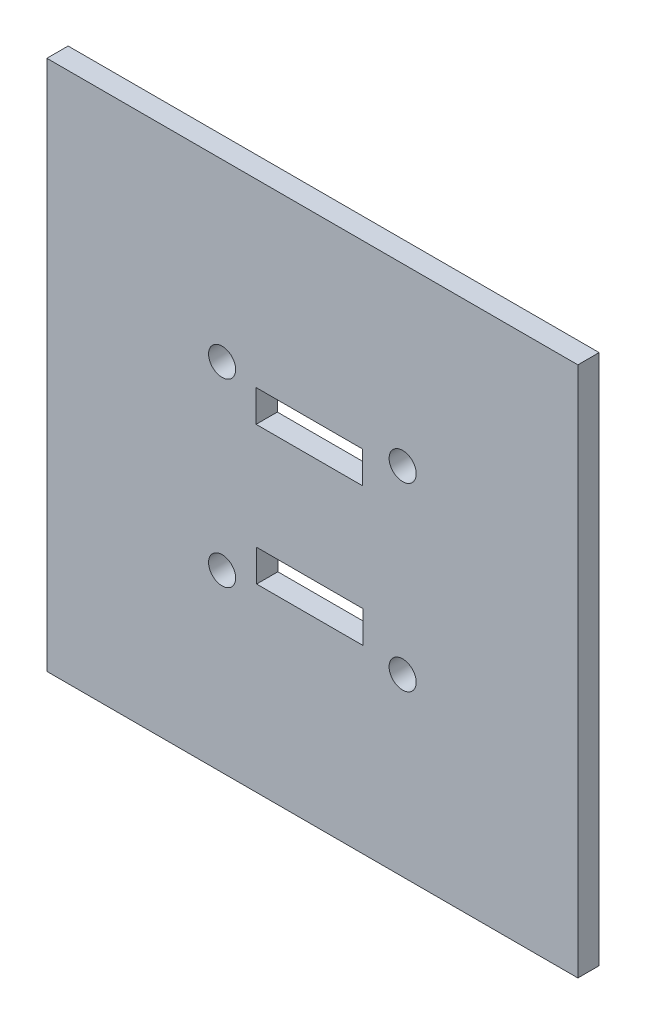
ISO-10303-21;
HEADER;
FILE_DESCRIPTION(('STEP AP214'),'2;1');
FILE_NAME('part.step','',(''),(''),'','','');
FILE_SCHEMA(('AUTOMOTIVE_DESIGN { 1 0 10303 214 1 1 1 1 }'));
ENDSEC;
DATA;
#1=APPLICATION_CONTEXT('core data for automotive mechanical design processes');
#2=APPLICATION_PROTOCOL_DEFINITION('international standard','automotive_design',2000,#1);
#3=PRODUCT_CONTEXT('',#1,'mechanical');
#4=PRODUCT('Part','Part','',(#3));
#5=PRODUCT_RELATED_PRODUCT_CATEGORY('part','',(#4));
#6=PRODUCT_DEFINITION_FORMATION('','',#4);
#7=PRODUCT_DEFINITION_CONTEXT('part definition',#1,'design');
#8=PRODUCT_DEFINITION('design','',#6,#7);
#9=PRODUCT_DEFINITION_SHAPE('','',#8);
#10=(LENGTH_UNIT() NAMED_UNIT(*) SI_UNIT(.MILLI.,.METRE.));
#11=(NAMED_UNIT(*) PLANE_ANGLE_UNIT() SI_UNIT($,.RADIAN.));
#12=(NAMED_UNIT(*) SI_UNIT($,.STERADIAN.) SOLID_ANGLE_UNIT());
#13=UNCERTAINTY_MEASURE_WITH_UNIT(LENGTH_MEASURE(1.E-05),#10,'distance_accuracy_value','');
#14=(GEOMETRIC_REPRESENTATION_CONTEXT(3) GLOBAL_UNCERTAINTY_ASSIGNED_CONTEXT((#13)) GLOBAL_UNIT_ASSIGNED_CONTEXT((#10,
#11,#12)) REPRESENTATION_CONTEXT('',''));
#15=CARTESIAN_POINT('',(0.,0.,0.));
#16=DIRECTION('',(0.,0.,1.));
#17=DIRECTION('',(1.,0.,0.));
#18=AXIS2_PLACEMENT_3D('',#15,#16,#17);
#19=CARTESIAN_POINT('',(0.,0.,2.));
#20=DIRECTION('',(1.,0.,0.));
#21=DIRECTION('',(0.,0.,-1.));
#22=AXIS2_PLACEMENT_3D('',#19,#20,#21);
#23=PLANE('',#22);
#24=DIRECTION('',(0.,-1.,0.));
#25=VECTOR('',#24,1.);
#26=CARTESIAN_POINT('',(0.,0.,0.));
#27=LINE('',#26,#25);
#28=CARTESIAN_POINT('',(0.,50.,0.));
#29=VERTEX_POINT('',#28);
#30=CARTESIAN_POINT('',(0.,0.,0.));
#31=VERTEX_POINT('',#30);
#32=EDGE_CURVE('E214',#29,#31,#27,.T.);
#33=ORIENTED_EDGE('',*,*,#32,.T.);
#34=DIRECTION('',(0.,0.,-1.));
#35=VECTOR('',#34,1.);
#36=CARTESIAN_POINT('',(0.,0.,2.));
#37=LINE('',#36,#35);
#38=CARTESIAN_POINT('',(0.,0.,2.));
#39=VERTEX_POINT('',#38);
#40=EDGE_CURVE('E11',#39,#31,#37,.T.);
#41=ORIENTED_EDGE('',*,*,#40,.F.);
#42=DIRECTION('',(0.,-1.,0.));
#43=VECTOR('',#42,1.);
#44=CARTESIAN_POINT('',(0.,0.,2.));
#45=LINE('',#44,#43);
#46=CARTESIAN_POINT('',(0.,50.,2.));
#47=VERTEX_POINT('',#46);
#48=EDGE_CURVE('E217',#47,#39,#45,.T.);
#49=ORIENTED_EDGE('',*,*,#48,.F.);
#50=DIRECTION('',(0.,0.,-1.));
#51=VECTOR('',#50,1.);
#52=CARTESIAN_POINT('',(0.,50.,2.));
#53=LINE('',#52,#51);
#54=EDGE_CURVE('E227',#47,#29,#53,.T.);
#55=ORIENTED_EDGE('',*,*,#54,.T.);
#56=EDGE_LOOP('',(#33,#41,#49,#55));
#57=FACE_BOUND('',#56,.T.);
#58=ADVANCED_FACE('F35',(#57),#23,.F.);
#59=CARTESIAN_POINT('',(0.,0.,2.));
#60=DIRECTION('',(0.,1.,0.));
#61=DIRECTION('',(0.,0.,1.));
#62=AXIS2_PLACEMENT_3D('',#59,#60,#61);
#63=PLANE('',#62);
#64=DIRECTION('',(1.,0.,0.));
#65=VECTOR('',#64,1.);
#66=CARTESIAN_POINT('',(0.,0.,0.));
#67=LINE('',#66,#65);
#68=CARTESIAN_POINT('',(50.,0.,0.));
#69=VERTEX_POINT('',#68);
#70=EDGE_CURVE('E230',#31,#69,#67,.T.);
#71=ORIENTED_EDGE('',*,*,#70,.T.);
#72=DIRECTION('',(0.,0.,-1.));
#73=VECTOR('',#72,1.);
#74=CARTESIAN_POINT('',(50.,0.,2.));
#75=LINE('',#74,#73);
#76=CARTESIAN_POINT('',(50.,0.,2.));
#77=VERTEX_POINT('',#76);
#78=EDGE_CURVE('E42',#77,#69,#75,.T.);
#79=ORIENTED_EDGE('',*,*,#78,.F.);
#80=DIRECTION('',(1.,0.,0.));
#81=VECTOR('',#80,1.);
#82=CARTESIAN_POINT('',(0.,0.,2.));
#83=LINE('',#82,#81);
#84=EDGE_CURVE('E220',#39,#77,#83,.T.);
#85=ORIENTED_EDGE('',*,*,#84,.F.);
#86=ORIENTED_EDGE('',*,*,#40,.T.);
#87=EDGE_LOOP('',(#71,#79,#85,#86));
#88=FACE_BOUND('',#87,.T.);
#89=ADVANCED_FACE('F259',(#88),#63,.F.);
#90=CARTESIAN_POINT('',(50.,0.,2.));
#91=DIRECTION('',(-1.,0.,0.));
#92=DIRECTION('',(0.,0.,1.));
#93=AXIS2_PLACEMENT_3D('',#90,#91,#92);
#94=PLANE('',#93);
#95=DIRECTION('',(0.,1.,0.));
#96=VECTOR('',#95,1.);
#97=CARTESIAN_POINT('',(50.,0.,0.));
#98=LINE('',#97,#96);
#99=CARTESIAN_POINT('',(50.,50.,0.));
#100=VERTEX_POINT('',#99);
#101=EDGE_CURVE('E232',#69,#100,#98,.T.);
#102=ORIENTED_EDGE('',*,*,#101,.T.);
#103=DIRECTION('',(0.,0.,-1.));
#104=VECTOR('',#103,1.);
#105=CARTESIAN_POINT('',(50.,50.,2.));
#106=LINE('',#105,#104);
#107=CARTESIAN_POINT('',(50.,50.,2.));
#108=VERTEX_POINT('',#107);
#109=EDGE_CURVE('E237',#108,#100,#106,.T.);
#110=ORIENTED_EDGE('',*,*,#109,.F.);
#111=DIRECTION('',(0.,1.,0.));
#112=VECTOR('',#111,1.);
#113=CARTESIAN_POINT('',(50.,0.,2.));
#114=LINE('',#113,#112);
#115=EDGE_CURVE('E223',#77,#108,#114,.T.);
#116=ORIENTED_EDGE('',*,*,#115,.F.);
#117=ORIENTED_EDGE('',*,*,#78,.T.);
#118=EDGE_LOOP('',(#102,#110,#116,#117));
#119=FACE_BOUND('',#118,.T.);
#120=ADVANCED_FACE('F244',(#119),#94,.F.);
#121=CARTESIAN_POINT('',(0.,50.,2.));
#122=DIRECTION('',(0.,-1.,0.));
#123=DIRECTION('',(0.,0.,-1.));
#124=AXIS2_PLACEMENT_3D('',#121,#122,#123);
#125=PLANE('',#124);
#126=DIRECTION('',(-1.,0.,0.));
#127=VECTOR('',#126,1.);
#128=CARTESIAN_POINT('',(0.,50.,0.));
#129=LINE('',#128,#127);
#130=EDGE_CURVE('E221',#100,#29,#129,.T.);
#131=ORIENTED_EDGE('',*,*,#130,.T.);
#132=ORIENTED_EDGE('',*,*,#54,.F.);
#133=DIRECTION('',(-1.,0.,0.));
#134=VECTOR('',#133,1.);
#135=CARTESIAN_POINT('',(0.,50.,2.));
#136=LINE('',#135,#134);
#137=EDGE_CURVE('E225',#108,#47,#136,.T.);
#138=ORIENTED_EDGE('',*,*,#137,.F.);
#139=ORIENTED_EDGE('',*,*,#109,.T.);
#140=EDGE_LOOP('',(#131,#132,#138,#139));
#141=FACE_BOUND('',#140,.T.);
#142=ADVANCED_FACE('F252',(#141),#125,.F.);
#143=CARTESIAN_POINT('',(0.,0.,2.));
#144=DIRECTION('',(0.,0.,-1.));
#145=DIRECTION('',(-1.,0.,0.));
#146=AXIS2_PLACEMENT_3D('',#143,#144,#145);
#147=PLANE('',#146);
#148=DIRECTION('',(1.,0.,0.));
#149=VECTOR('',#148,1.);
#150=CARTESIAN_POINT('',(19.7,30.,2.));
#151=LINE('',#150,#149);
#152=CARTESIAN_POINT('',(19.7,30.,2.));
#153=VERTEX_POINT('',#152);
#154=CARTESIAN_POINT('',(29.7,30.,2.));
#155=VERTEX_POINT('',#154);
#156=EDGE_CURVE('E147',#153,#155,#151,.T.);
#157=ORIENTED_EDGE('',*,*,#156,.F.);
#158=DIRECTION('',(0.,-1.,0.));
#159=VECTOR('',#158,1.);
#160=CARTESIAN_POINT('',(19.7,33.,2.));
#161=LINE('',#160,#159);
#162=CARTESIAN_POINT('',(19.7,33.,2.));
#163=VERTEX_POINT('',#162);
#164=EDGE_CURVE('E49',#163,#153,#161,.T.);
#165=ORIENTED_EDGE('',*,*,#164,.F.);
#166=DIRECTION('',(-1.,0.,0.));
#167=VECTOR('',#166,1.);
#168=CARTESIAN_POINT('',(19.7,33.,2.));
#169=LINE('',#168,#167);
#170=CARTESIAN_POINT('',(29.7,33.,2.));
#171=VERTEX_POINT('',#170);
#172=EDGE_CURVE('E140',#171,#163,#169,.T.);
#173=ORIENTED_EDGE('',*,*,#172,.F.);
#174=DIRECTION('',(0.,1.,0.));
#175=VECTOR('',#174,1.);
#176=CARTESIAN_POINT('',(29.7,33.,2.));
#177=LINE('',#176,#175);
#178=EDGE_CURVE('E154',#155,#171,#177,.T.);
#179=ORIENTED_EDGE('',*,*,#178,.F.);
#180=EDGE_LOOP('',(#157,#165,#173,#179));
#181=FACE_BOUND('',#180,.T.);
#182=DIRECTION('',(1.,0.,0.));
#183=VECTOR('',#182,1.);
#184=CARTESIAN_POINT('',(19.75,17.,2.));
#185=LINE('',#184,#183);
#186=CARTESIAN_POINT('',(19.75,17.,2.));
#187=VERTEX_POINT('',#186);
#188=CARTESIAN_POINT('',(29.75,17.,2.));
#189=VERTEX_POINT('',#188);
#190=EDGE_CURVE('E173',#187,#189,#185,.T.);
#191=ORIENTED_EDGE('',*,*,#190,.F.);
#192=DIRECTION('',(0.,-1.,0.));
#193=VECTOR('',#192,1.);
#194=CARTESIAN_POINT('',(19.75,20.,2.));
#195=LINE('',#194,#193);
#196=CARTESIAN_POINT('',(19.75,20.,2.));
#197=VERTEX_POINT('',#196);
#198=EDGE_CURVE('E57',#197,#187,#195,.T.);
#199=ORIENTED_EDGE('',*,*,#198,.F.);
#200=DIRECTION('',(-1.,0.,0.));
#201=VECTOR('',#200,1.);
#202=CARTESIAN_POINT('',(19.75,20.,2.));
#203=LINE('',#202,#201);
#204=CARTESIAN_POINT('',(29.75,20.,2.));
#205=VERTEX_POINT('',#204);
#206=EDGE_CURVE('E179',#205,#197,#203,.T.);
#207=ORIENTED_EDGE('',*,*,#206,.F.);
#208=DIRECTION('',(0.,1.,0.));
#209=VECTOR('',#208,1.);
#210=CARTESIAN_POINT('',(29.75,20.,2.));
#211=LINE('',#210,#209);
#212=EDGE_CURVE('E176',#189,#205,#211,.T.);
#213=ORIENTED_EDGE('',*,*,#212,.F.);
#214=EDGE_LOOP('',(#191,#199,#207,#213));
#215=FACE_BOUND('',#214,.T.);
#216=CARTESIAN_POINT('',(16.5000000000002,16.5,2.));
#217=DIRECTION('',(0.,0.,1.));
#218=DIRECTION('',(1.,0.,0.));
#219=AXIS2_PLACEMENT_3D('',#216,#217,#218);
#220=CIRCLE('',#219,1.275);
#221=CARTESIAN_POINT('',(17.7750000000002,16.5,2.));
#222=VERTEX_POINT('',#221);
#223=EDGE_CURVE('E206',#222,#222,#220,.T.);
#224=ORIENTED_EDGE('',*,*,#223,.F.);
#225=EDGE_LOOP('',(#224));
#226=FACE_BOUND('',#225,.T.);
#227=CARTESIAN_POINT('',(33.5000000000002,16.5,2.));
#228=DIRECTION('',(0.,0.,1.));
#229=DIRECTION('',(1.,0.,0.));
#230=AXIS2_PLACEMENT_3D('',#227,#228,#229);
#231=CIRCLE('',#230,1.275);
#232=CARTESIAN_POINT('',(34.7750000000002,16.5,2.));
#233=VERTEX_POINT('',#232);
#234=EDGE_CURVE('E200',#233,#233,#231,.T.);
#235=ORIENTED_EDGE('',*,*,#234,.F.);
#236=EDGE_LOOP('',(#235));
#237=FACE_BOUND('',#236,.T.);
#238=CARTESIAN_POINT('',(33.5,33.5,2.));
#239=DIRECTION('',(0.,0.,1.));
#240=DIRECTION('',(1.,0.,0.));
#241=AXIS2_PLACEMENT_3D('',#238,#239,#240);
#242=CIRCLE('',#241,1.275);
#243=CARTESIAN_POINT('',(34.775,33.5,2.));
#244=VERTEX_POINT('',#243);
#245=EDGE_CURVE('E193',#244,#244,#242,.T.);
#246=ORIENTED_EDGE('',*,*,#245,.F.);
#247=EDGE_LOOP('',(#246));
#248=FACE_BOUND('',#247,.T.);
#249=CARTESIAN_POINT('',(16.5,33.5,2.));
#250=DIRECTION('',(0.,0.,1.));
#251=DIRECTION('',(1.,0.,0.));
#252=AXIS2_PLACEMENT_3D('',#249,#250,#251);
#253=CIRCLE('',#252,1.275);
#254=CARTESIAN_POINT('',(17.775,33.5,2.));
#255=VERTEX_POINT('',#254);
#256=EDGE_CURVE('E211',#255,#255,#253,.T.);
#257=ORIENTED_EDGE('',*,*,#256,.F.);
#258=EDGE_LOOP('',(#257));
#259=FACE_BOUND('',#258,.T.);
#260=ORIENTED_EDGE('',*,*,#48,.T.);
#261=ORIENTED_EDGE('',*,*,#84,.T.);
#262=ORIENTED_EDGE('',*,*,#115,.T.);
#263=ORIENTED_EDGE('',*,*,#137,.T.);
#264=EDGE_LOOP('',(#260,#261,#262,#263));
#265=FACE_BOUND('',#264,.T.);
#266=ADVANCED_FACE('F258',(#181,#215,#226,#237,#248,#259,#265),#147,.F.);
#267=CARTESIAN_POINT('',(0.,0.,0.));
#268=DIRECTION('',(0.,0.,-1.));
#269=DIRECTION('',(-1.,0.,0.));
#270=AXIS2_PLACEMENT_3D('',#267,#268,#269);
#271=PLANE('',#270);
#272=DIRECTION('',(0.,-1.,0.));
#273=VECTOR('',#272,1.);
#274=CARTESIAN_POINT('',(19.7,33.,0.));
#275=LINE('',#274,#273);
#276=CARTESIAN_POINT('',(19.7,33.,0.));
#277=VERTEX_POINT('',#276);
#278=CARTESIAN_POINT('',(19.7,30.,0.));
#279=VERTEX_POINT('',#278);
#280=EDGE_CURVE('E138',#277,#279,#275,.T.);
#281=ORIENTED_EDGE('',*,*,#280,.T.);
#282=DIRECTION('',(1.,0.,0.));
#283=VECTOR('',#282,1.);
#284=CARTESIAN_POINT('',(19.7,30.,0.));
#285=LINE('',#284,#283);
#286=CARTESIAN_POINT('',(29.7,30.,0.));
#287=VERTEX_POINT('',#286);
#288=EDGE_CURVE('E124',#279,#287,#285,.T.);
#289=ORIENTED_EDGE('',*,*,#288,.T.);
#290=DIRECTION('',(0.,1.,0.));
#291=VECTOR('',#290,1.);
#292=CARTESIAN_POINT('',(29.7,33.,0.));
#293=LINE('',#292,#291);
#294=CARTESIAN_POINT('',(29.7,33.,0.));
#295=VERTEX_POINT('',#294);
#296=EDGE_CURVE('E149',#287,#295,#293,.T.);
#297=ORIENTED_EDGE('',*,*,#296,.T.);
#298=DIRECTION('',(-1.,0.,0.));
#299=VECTOR('',#298,1.);
#300=CARTESIAN_POINT('',(19.7,33.,0.));
#301=LINE('',#300,#299);
#302=EDGE_CURVE('E145',#295,#277,#301,.T.);
#303=ORIENTED_EDGE('',*,*,#302,.T.);
#304=EDGE_LOOP('',(#281,#289,#297,#303));
#305=FACE_BOUND('',#304,.T.);
#306=DIRECTION('',(0.,-1.,0.));
#307=VECTOR('',#306,1.);
#308=CARTESIAN_POINT('',(19.75,20.,0.));
#309=LINE('',#308,#307);
#310=CARTESIAN_POINT('',(19.75,20.,0.));
#311=VERTEX_POINT('',#310);
#312=CARTESIAN_POINT('',(19.75,17.,0.));
#313=VERTEX_POINT('',#312);
#314=EDGE_CURVE('E169',#311,#313,#309,.T.);
#315=ORIENTED_EDGE('',*,*,#314,.T.);
#316=DIRECTION('',(1.,0.,0.));
#317=VECTOR('',#316,1.);
#318=CARTESIAN_POINT('',(19.75,17.,0.));
#319=LINE('',#318,#317);
#320=CARTESIAN_POINT('',(29.75,17.,0.));
#321=VERTEX_POINT('',#320);
#322=EDGE_CURVE('E185',#313,#321,#319,.T.);
#323=ORIENTED_EDGE('',*,*,#322,.T.);
#324=DIRECTION('',(0.,1.,0.));
#325=VECTOR('',#324,1.);
#326=CARTESIAN_POINT('',(29.75,20.,0.));
#327=LINE('',#326,#325);
#328=CARTESIAN_POINT('',(29.75,20.,0.));
#329=VERTEX_POINT('',#328);
#330=EDGE_CURVE('E163',#321,#329,#327,.T.);
#331=ORIENTED_EDGE('',*,*,#330,.T.);
#332=DIRECTION('',(-1.,0.,0.));
#333=VECTOR('',#332,1.);
#334=CARTESIAN_POINT('',(19.75,20.,0.));
#335=LINE('',#334,#333);
#336=EDGE_CURVE('E166',#329,#311,#335,.T.);
#337=ORIENTED_EDGE('',*,*,#336,.T.);
#338=EDGE_LOOP('',(#315,#323,#331,#337));
#339=FACE_BOUND('',#338,.T.);
#340=CARTESIAN_POINT('',(16.5000000000002,16.5,0.));
#341=DIRECTION('',(0.,0.,-1.));
#342=DIRECTION('',(-1.,0.,0.));
#343=AXIS2_PLACEMENT_3D('',#340,#341,#342);
#344=CIRCLE('',#343,1.275);
#345=CARTESIAN_POINT('',(15.2250000000002,16.5,0.));
#346=VERTEX_POINT('',#345);
#347=EDGE_CURVE('E134',#346,#346,#344,.F.);
#348=ORIENTED_EDGE('',*,*,#347,.T.);
#349=EDGE_LOOP('',(#348));
#350=FACE_BOUND('',#349,.T.);
#351=CARTESIAN_POINT('',(33.5000000000002,16.5,0.));
#352=DIRECTION('',(0.,0.,-1.));
#353=DIRECTION('',(-1.,0.,0.));
#354=AXIS2_PLACEMENT_3D('',#351,#352,#353);
#355=CIRCLE('',#354,1.275);
#356=CARTESIAN_POINT('',(32.2250000000002,16.5,0.));
#357=VERTEX_POINT('',#356);
#358=EDGE_CURVE('E203',#357,#357,#355,.F.);
#359=ORIENTED_EDGE('',*,*,#358,.T.);
#360=EDGE_LOOP('',(#359));
#361=FACE_BOUND('',#360,.T.);
#362=CARTESIAN_POINT('',(33.5,33.5,0.));
#363=DIRECTION('',(0.,0.,-1.));
#364=DIRECTION('',(-1.,0.,0.));
#365=AXIS2_PLACEMENT_3D('',#362,#363,#364);
#366=CIRCLE('',#365,1.275);
#367=CARTESIAN_POINT('',(32.225,33.5,0.));
#368=VERTEX_POINT('',#367);
#369=EDGE_CURVE('E197',#368,#368,#366,.F.);
#370=ORIENTED_EDGE('',*,*,#369,.T.);
#371=EDGE_LOOP('',(#370));
#372=FACE_BOUND('',#371,.T.);
#373=CARTESIAN_POINT('',(16.5,33.5,0.));
#374=DIRECTION('',(0.,0.,-1.));
#375=DIRECTION('',(-1.,0.,0.));
#376=AXIS2_PLACEMENT_3D('',#373,#374,#375);
#377=CIRCLE('',#376,1.275);
#378=CARTESIAN_POINT('',(15.225,33.5,0.));
#379=VERTEX_POINT('',#378);
#380=EDGE_CURVE('E196',#379,#379,#377,.F.);
#381=ORIENTED_EDGE('',*,*,#380,.T.);
#382=EDGE_LOOP('',(#381));
#383=FACE_BOUND('',#382,.T.);
#384=ORIENTED_EDGE('',*,*,#32,.F.);
#385=ORIENTED_EDGE('',*,*,#130,.F.);
#386=ORIENTED_EDGE('',*,*,#101,.F.);
#387=ORIENTED_EDGE('',*,*,#70,.F.);
#388=EDGE_LOOP('',(#384,#385,#386,#387));
#389=FACE_BOUND('',#388,.T.);
#390=ADVANCED_FACE('F143',(#305,#339,#350,#361,#372,#383,#389),#271,.T.);
#391=CARTESIAN_POINT('',(16.5,33.5,-0.00100000000000013));
#392=DIRECTION('',(0.,0.,1.));
#393=DIRECTION('',(1.,0.,0.));
#394=AXIS2_PLACEMENT_3D('',#391,#392,#393);
#395=CYLINDRICAL_SURFACE('',#394,1.275);
#396=ORIENTED_EDGE('',*,*,#380,.F.);
#397=EDGE_LOOP('',(#396));
#398=FACE_BOUND('',#397,.T.);
#399=ORIENTED_EDGE('',*,*,#256,.T.);
#400=EDGE_LOOP('',(#399));
#401=FACE_BOUND('',#400,.T.);
#402=ADVANCED_FACE('F271',(#398,#401),#395,.F.);
#403=CARTESIAN_POINT('',(33.5,33.5,-0.00100000000000013));
#404=DIRECTION('',(0.,0.,1.));
#405=DIRECTION('',(1.,0.,0.));
#406=AXIS2_PLACEMENT_3D('',#403,#404,#405);
#407=CYLINDRICAL_SURFACE('',#406,1.275);
#408=ORIENTED_EDGE('',*,*,#369,.F.);
#409=EDGE_LOOP('',(#408));
#410=FACE_BOUND('',#409,.T.);
#411=ORIENTED_EDGE('',*,*,#245,.T.);
#412=EDGE_LOOP('',(#411));
#413=FACE_BOUND('',#412,.T.);
#414=ADVANCED_FACE('F277',(#410,#413),#407,.F.);
#415=CARTESIAN_POINT('',(33.5000000000002,16.5,-0.00100000000000013));
#416=DIRECTION('',(0.,0.,1.));
#417=DIRECTION('',(1.,0.,0.));
#418=AXIS2_PLACEMENT_3D('',#415,#416,#417);
#419=CYLINDRICAL_SURFACE('',#418,1.275);
#420=ORIENTED_EDGE('',*,*,#358,.F.);
#421=EDGE_LOOP('',(#420));
#422=FACE_BOUND('',#421,.T.);
#423=ORIENTED_EDGE('',*,*,#234,.T.);
#424=EDGE_LOOP('',(#423));
#425=FACE_BOUND('',#424,.T.);
#426=ADVANCED_FACE('F283',(#422,#425),#419,.F.);
#427=CARTESIAN_POINT('',(16.5000000000002,16.5,-0.00100000000000013));
#428=DIRECTION('',(0.,0.,1.));
#429=DIRECTION('',(1.,0.,0.));
#430=AXIS2_PLACEMENT_3D('',#427,#428,#429);
#431=CYLINDRICAL_SURFACE('',#430,1.275);
#432=ORIENTED_EDGE('',*,*,#347,.F.);
#433=EDGE_LOOP('',(#432));
#434=FACE_BOUND('',#433,.T.);
#435=ORIENTED_EDGE('',*,*,#223,.T.);
#436=EDGE_LOOP('',(#435));
#437=FACE_BOUND('',#436,.T.);
#438=ADVANCED_FACE('F279',(#434,#437),#431,.F.);
#439=CARTESIAN_POINT('',(19.75,20.,-0.00100000000000013));
#440=DIRECTION('',(-1.,0.,0.));
#441=DIRECTION('',(0.,0.,1.));
#442=AXIS2_PLACEMENT_3D('',#439,#440,#441);
#443=PLANE('',#442);
#444=DIRECTION('',(0.,0.,1.));
#445=VECTOR('',#444,1.);
#446=CARTESIAN_POINT('',(19.75,20.,-0.00100000000000013));
#447=LINE('',#446,#445);
#448=EDGE_CURVE('E183',#311,#197,#447,.T.);
#449=ORIENTED_EDGE('',*,*,#448,.T.);
#450=ORIENTED_EDGE('',*,*,#198,.T.);
#451=DIRECTION('',(0.,0.,1.));
#452=VECTOR('',#451,1.);
#453=CARTESIAN_POINT('',(19.75,17.,-0.00100000000000013));
#454=LINE('',#453,#452);
#455=EDGE_CURVE('E182',#313,#187,#454,.T.);
#456=ORIENTED_EDGE('',*,*,#455,.F.);
#457=ORIENTED_EDGE('',*,*,#314,.F.);
#458=EDGE_LOOP('',(#449,#450,#456,#457));
#459=FACE_BOUND('',#458,.T.);
#460=ADVANCED_FACE('F282',(#459),#443,.F.);
#461=CARTESIAN_POINT('',(19.75,20.,-0.00100000000000013));
#462=DIRECTION('',(0.,1.,0.));
#463=DIRECTION('',(0.,0.,1.));
#464=AXIS2_PLACEMENT_3D('',#461,#462,#463);
#465=PLANE('',#464);
#466=DIRECTION('',(0.,0.,1.));
#467=VECTOR('',#466,1.);
#468=CARTESIAN_POINT('',(29.75,20.,-0.00100000000000013));
#469=LINE('',#468,#467);
#470=EDGE_CURVE('E186',#329,#205,#469,.T.);
#471=ORIENTED_EDGE('',*,*,#470,.T.);
#472=ORIENTED_EDGE('',*,*,#206,.T.);
#473=ORIENTED_EDGE('',*,*,#448,.F.);
#474=ORIENTED_EDGE('',*,*,#336,.F.);
#475=EDGE_LOOP('',(#471,#472,#473,#474));
#476=FACE_BOUND('',#475,.T.);
#477=ADVANCED_FACE('F293',(#476),#465,.F.);
#478=CARTESIAN_POINT('',(29.75,20.,-0.00100000000000013));
#479=DIRECTION('',(1.,0.,0.));
#480=DIRECTION('',(0.,0.,-1.));
#481=AXIS2_PLACEMENT_3D('',#478,#479,#480);
#482=PLANE('',#481);
#483=DIRECTION('',(0.,0.,1.));
#484=VECTOR('',#483,1.);
#485=CARTESIAN_POINT('',(29.75,17.,-0.00100000000000013));
#486=LINE('',#485,#484);
#487=EDGE_CURVE('E188',#321,#189,#486,.T.);
#488=ORIENTED_EDGE('',*,*,#487,.T.);
#489=ORIENTED_EDGE('',*,*,#212,.T.);
#490=ORIENTED_EDGE('',*,*,#470,.F.);
#491=ORIENTED_EDGE('',*,*,#330,.F.);
#492=EDGE_LOOP('',(#488,#489,#490,#491));
#493=FACE_BOUND('',#492,.T.);
#494=ADVANCED_FACE('F297',(#493),#482,.F.);
#495=CARTESIAN_POINT('',(19.75,17.,-0.00100000000000013));
#496=DIRECTION('',(0.,-1.,0.));
#497=DIRECTION('',(0.,0.,-1.));
#498=AXIS2_PLACEMENT_3D('',#495,#496,#497);
#499=PLANE('',#498);
#500=ORIENTED_EDGE('',*,*,#455,.T.);
#501=ORIENTED_EDGE('',*,*,#190,.T.);
#502=ORIENTED_EDGE('',*,*,#487,.F.);
#503=ORIENTED_EDGE('',*,*,#322,.F.);
#504=EDGE_LOOP('',(#500,#501,#502,#503));
#505=FACE_BOUND('',#504,.T.);
#506=ADVANCED_FACE('F294',(#505),#499,.F.);
#507=CARTESIAN_POINT('',(19.7,33.,-0.00100000000000013));
#508=DIRECTION('',(-1.,0.,0.));
#509=DIRECTION('',(0.,0.,1.));
#510=AXIS2_PLACEMENT_3D('',#507,#508,#509);
#511=PLANE('',#510);
#512=DIRECTION('',(0.,0.,1.));
#513=VECTOR('',#512,1.);
#514=CARTESIAN_POINT('',(19.7,33.,-0.00100000000000013));
#515=LINE('',#514,#513);
#516=EDGE_CURVE('E135',#277,#163,#515,.T.);
#517=ORIENTED_EDGE('',*,*,#516,.T.);
#518=ORIENTED_EDGE('',*,*,#164,.T.);
#519=DIRECTION('',(0.,0.,1.));
#520=VECTOR('',#519,1.);
#521=CARTESIAN_POINT('',(19.7,30.,-0.00100000000000013));
#522=LINE('',#521,#520);
#523=EDGE_CURVE('E127',#279,#153,#522,.T.);
#524=ORIENTED_EDGE('',*,*,#523,.F.);
#525=ORIENTED_EDGE('',*,*,#280,.F.);
#526=EDGE_LOOP('',(#517,#518,#524,#525));
#527=FACE_BOUND('',#526,.T.);
#528=ADVANCED_FACE('F137',(#527),#511,.F.);
#529=CARTESIAN_POINT('',(19.7,33.,-0.00100000000000013));
#530=DIRECTION('',(0.,1.,0.));
#531=DIRECTION('',(0.,0.,1.));
#532=AXIS2_PLACEMENT_3D('',#529,#530,#531);
#533=PLANE('',#532);
#534=DIRECTION('',(0.,0.,1.));
#535=VECTOR('',#534,1.);
#536=CARTESIAN_POINT('',(29.7,33.,-0.00100000000000013));
#537=LINE('',#536,#535);
#538=EDGE_CURVE('E160',#295,#171,#537,.T.);
#539=ORIENTED_EDGE('',*,*,#538,.T.);
#540=ORIENTED_EDGE('',*,*,#172,.T.);
#541=ORIENTED_EDGE('',*,*,#516,.F.);
#542=ORIENTED_EDGE('',*,*,#302,.F.);
#543=EDGE_LOOP('',(#539,#540,#541,#542));
#544=FACE_BOUND('',#543,.T.);
#545=ADVANCED_FACE('F307',(#544),#533,.F.);
#546=CARTESIAN_POINT('',(29.7,33.,-0.00100000000000013));
#547=DIRECTION('',(1.,0.,0.));
#548=DIRECTION('',(0.,0.,-1.));
#549=AXIS2_PLACEMENT_3D('',#546,#547,#548);
#550=PLANE('',#549);
#551=DIRECTION('',(0.,0.,1.));
#552=VECTOR('',#551,1.);
#553=CARTESIAN_POINT('',(29.7,30.,-0.00100000000000013));
#554=LINE('',#553,#552);
#555=EDGE_CURVE('E129',#287,#155,#554,.T.);
#556=ORIENTED_EDGE('',*,*,#555,.T.);
#557=ORIENTED_EDGE('',*,*,#178,.T.);
#558=ORIENTED_EDGE('',*,*,#538,.F.);
#559=ORIENTED_EDGE('',*,*,#296,.F.);
#560=EDGE_LOOP('',(#556,#557,#558,#559));
#561=FACE_BOUND('',#560,.T.);
#562=ADVANCED_FACE('F310',(#561),#550,.F.);
#563=CARTESIAN_POINT('',(19.7,30.,-0.00100000000000013));
#564=DIRECTION('',(0.,-1.,0.));
#565=DIRECTION('',(0.,0.,-1.));
#566=AXIS2_PLACEMENT_3D('',#563,#564,#565);
#567=PLANE('',#566);
#568=ORIENTED_EDGE('',*,*,#523,.T.);
#569=ORIENTED_EDGE('',*,*,#156,.T.);
#570=ORIENTED_EDGE('',*,*,#555,.F.);
#571=ORIENTED_EDGE('',*,*,#288,.F.);
#572=EDGE_LOOP('',(#568,#569,#570,#571));
#573=FACE_BOUND('',#572,.T.);
#574=ADVANCED_FACE('F125',(#573),#567,.F.);
#575=CLOSED_SHELL('',(#58,#89,#120,#142,#266,#390,#402,#414,#426,#438,#460,#477,#494,#506,#528,
#545,#562,#574));
#576=MANIFOLD_SOLID_BREP('B2',#575);
#577=ADVANCED_BREP_SHAPE_REPRESENTATION('',(#18,#576),#14);
#578=SHAPE_DEFINITION_REPRESENTATION(#9,#577);
ENDSEC;
END-ISO-10303-21;
